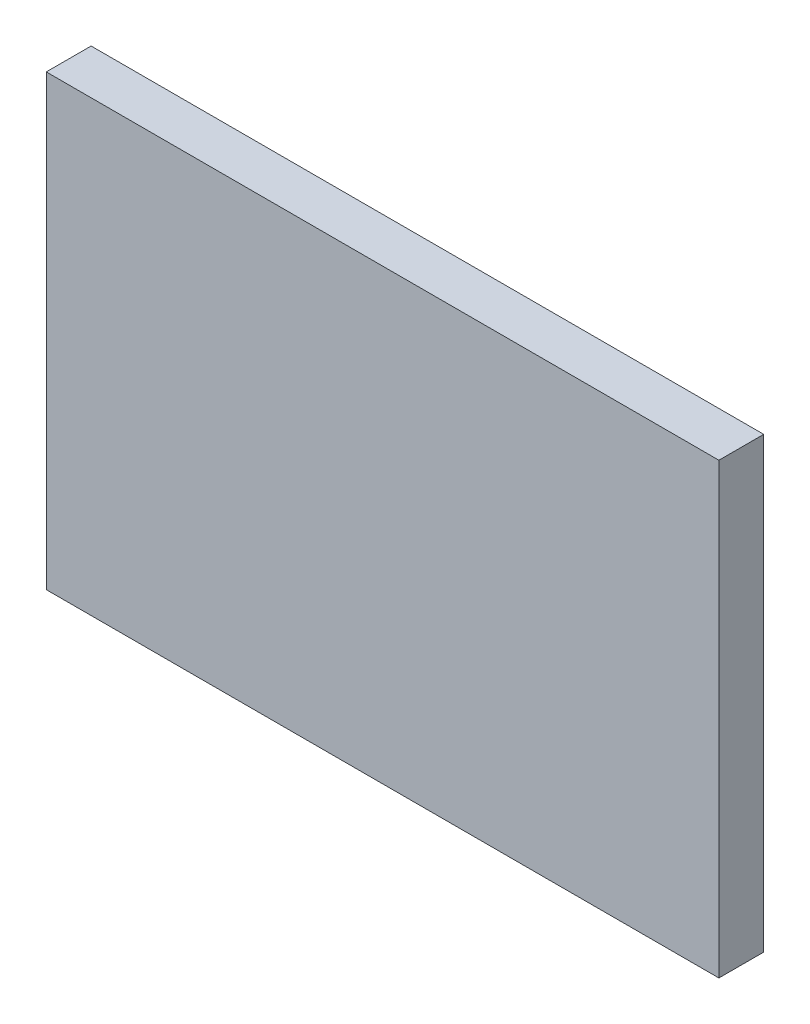
ISO-10303-21;
HEADER;
FILE_DESCRIPTION(('STEP AP214'),'2;1');
FILE_NAME('part.step','',(''),(''),'','','');
FILE_SCHEMA(('AUTOMOTIVE_DESIGN { 1 0 10303 214 1 1 1 1 }'));
ENDSEC;
DATA;
#1=APPLICATION_CONTEXT('core data for automotive mechanical design processes');
#2=APPLICATION_PROTOCOL_DEFINITION('international standard','automotive_design',2000,#1);
#3=PRODUCT_CONTEXT('',#1,'mechanical');
#4=PRODUCT('Part','Part','',(#3));
#5=PRODUCT_RELATED_PRODUCT_CATEGORY('part','',(#4));
#6=PRODUCT_DEFINITION_FORMATION('','',#4);
#7=PRODUCT_DEFINITION_CONTEXT('part definition',#1,'design');
#8=PRODUCT_DEFINITION('design','',#6,#7);
#9=PRODUCT_DEFINITION_SHAPE('','',#8);
#10=(LENGTH_UNIT() NAMED_UNIT(*) SI_UNIT(.MILLI.,.METRE.));
#11=(NAMED_UNIT(*) PLANE_ANGLE_UNIT() SI_UNIT($,.RADIAN.));
#12=(NAMED_UNIT(*) SI_UNIT($,.STERADIAN.) SOLID_ANGLE_UNIT());
#13=UNCERTAINTY_MEASURE_WITH_UNIT(LENGTH_MEASURE(1.E-05),#10,'distance_accuracy_value','');
#14=(GEOMETRIC_REPRESENTATION_CONTEXT(3) GLOBAL_UNCERTAINTY_ASSIGNED_CONTEXT((#13)) GLOBAL_UNIT_ASSIGNED_CONTEXT((#10,
#11,#12)) REPRESENTATION_CONTEXT('',''));
#15=CARTESIAN_POINT('',(0.,0.,0.));
#16=DIRECTION('',(0.,0.,1.));
#17=DIRECTION('',(1.,0.,0.));
#18=AXIS2_PLACEMENT_3D('',#15,#16,#17);
#19=CARTESIAN_POINT('',(0.,0.,2.));
#20=DIRECTION('',(0.,0.,1.));
#21=DIRECTION('',(0.,-1.,0.));
#22=AXIS2_PLACEMENT_3D('',#19,#20,#21);
#23=PLANE('',#22);
#24=DIRECTION('',(1.,0.,0.));
#25=VECTOR('',#24,1.);
#26=CARTESIAN_POINT('',(15.,9.99999999999996,1.99999999999996));
#27=LINE('',#26,#25);
#28=CARTESIAN_POINT('',(-15.,10.0000000000001,1.99999999999996));
#29=VERTEX_POINT('',#28);
#30=CARTESIAN_POINT('',(15.,9.99999999999996,1.99999999999996));
#31=VERTEX_POINT('',#30);
#32=EDGE_CURVE('E127',#29,#31,#27,.T.);
#33=ORIENTED_EDGE('',*,*,#32,.F.);
#34=DIRECTION('',(0.,1.,0.));
#35=VECTOR('',#34,1.);
#36=CARTESIAN_POINT('',(-15.,10.0000000000001,1.99999999999996));
#37=LINE('',#36,#35);
#38=CARTESIAN_POINT('',(-15.,-9.99999999999994,2.00000000000004));
#39=VERTEX_POINT('',#38);
#40=EDGE_CURVE('E125',#39,#29,#37,.T.);
#41=ORIENTED_EDGE('',*,*,#40,.F.);
#42=DIRECTION('',(-1.,0.,0.));
#43=VECTOR('',#42,1.);
#44=CARTESIAN_POINT('',(-15.,-9.99999999999994,2.00000000000004));
#45=LINE('',#44,#43);
#46=CARTESIAN_POINT('',(15.,-10.,2.00000000000004));
#47=VERTEX_POINT('',#46);
#48=EDGE_CURVE('E61',#47,#39,#45,.T.);
#49=ORIENTED_EDGE('',*,*,#48,.F.);
#50=DIRECTION('',(0.,-1.,0.));
#51=VECTOR('',#50,1.);
#52=CARTESIAN_POINT('',(15.,-10.,2.00000000000004));
#53=LINE('',#52,#51);
#54=EDGE_CURVE('E12',#31,#47,#53,.T.);
#55=ORIENTED_EDGE('',*,*,#54,.F.);
#56=EDGE_LOOP('',(#33,#41,#49,#55));
#57=FACE_BOUND('',#56,.T.);
#58=ADVANCED_FACE('F51',(#57),#23,.T.);
#59=CARTESIAN_POINT('',(0.,0.,0.));
#60=DIRECTION('',(0.,0.,1.));
#61=DIRECTION('',(1.,0.,0.));
#62=AXIS2_PLACEMENT_3D('',#59,#60,#61);
#63=PLANE('',#62);
#64=DIRECTION('',(-1.,0.,0.));
#65=VECTOR('',#64,1.);
#66=CARTESIAN_POINT('',(15.,10.,0.));
#67=LINE('',#66,#65);
#68=CARTESIAN_POINT('',(15.,10.,0.));
#69=VERTEX_POINT('',#68);
#70=CARTESIAN_POINT('',(-15.,10.,0.));
#71=VERTEX_POINT('',#70);
#72=EDGE_CURVE('E100',#69,#71,#67,.T.);
#73=ORIENTED_EDGE('',*,*,#72,.F.);
#74=DIRECTION('',(0.,1.,0.));
#75=VECTOR('',#74,1.);
#76=CARTESIAN_POINT('',(15.,-10.,0.));
#77=LINE('',#76,#75);
#78=CARTESIAN_POINT('',(15.,-10.,0.));
#79=VERTEX_POINT('',#78);
#80=EDGE_CURVE('E179',#79,#69,#77,.T.);
#81=ORIENTED_EDGE('',*,*,#80,.F.);
#82=DIRECTION('',(1.,0.,0.));
#83=VECTOR('',#82,1.);
#84=CARTESIAN_POINT('',(-15.,-10.,0.));
#85=LINE('',#84,#83);
#86=CARTESIAN_POINT('',(-15.,-10.,0.));
#87=VERTEX_POINT('',#86);
#88=EDGE_CURVE('E102',#87,#79,#85,.T.);
#89=ORIENTED_EDGE('',*,*,#88,.F.);
#90=DIRECTION('',(0.,-1.,0.));
#91=VECTOR('',#90,1.);
#92=CARTESIAN_POINT('',(-15.,10.,0.));
#93=LINE('',#92,#91);
#94=EDGE_CURVE('E96',#71,#87,#93,.T.);
#95=ORIENTED_EDGE('',*,*,#94,.F.);
#96=EDGE_LOOP('',(#73,#81,#89,#95));
#97=FACE_BOUND('',#96,.T.);
#98=ADVANCED_FACE('F99',(#97),#63,.F.);
#99=CARTESIAN_POINT('',(0.,-9.99999999999995,-2.42861286636748E-13));
#100=DIRECTION('',(0.,-1.,0.));
#101=DIRECTION('',(0.,0.,-1.));
#102=AXIS2_PLACEMENT_3D('',#99,#100,#101);
#103=PLANE('',#102);
#104=DIRECTION('',(0.,0.,1.));
#105=VECTOR('',#104,1.);
#106=CARTESIAN_POINT('',(15.,-10.,0.));
#107=LINE('',#106,#105);
#108=EDGE_CURVE('E76',#79,#47,#107,.T.);
#109=ORIENTED_EDGE('',*,*,#108,.T.);
#110=ORIENTED_EDGE('',*,*,#48,.T.);
#111=DIRECTION('',(0.,0.,1.));
#112=VECTOR('',#111,1.);
#113=CARTESIAN_POINT('',(-15.,-10.,0.));
#114=LINE('',#113,#112);
#115=EDGE_CURVE('E130',#87,#39,#114,.T.);
#116=ORIENTED_EDGE('',*,*,#115,.F.);
#117=ORIENTED_EDGE('',*,*,#88,.T.);
#118=EDGE_LOOP('',(#109,#110,#116,#117));
#119=FACE_BOUND('',#118,.T.);
#120=ADVANCED_FACE('F152',(#119),#103,.T.);
#121=CARTESIAN_POINT('',(-15.,0.,-3.51281503885296E-13));
#122=DIRECTION('',(-1.,0.,0.));
#123=DIRECTION('',(0.,0.,1.));
#124=AXIS2_PLACEMENT_3D('',#121,#122,#123);
#125=PLANE('',#124);
#126=ORIENTED_EDGE('',*,*,#115,.T.);
#127=ORIENTED_EDGE('',*,*,#40,.T.);
#128=DIRECTION('',(0.,0.,1.));
#129=VECTOR('',#128,1.);
#130=CARTESIAN_POINT('',(-15.,10.,0.));
#131=LINE('',#130,#129);
#132=EDGE_CURVE('E116',#71,#29,#131,.T.);
#133=ORIENTED_EDGE('',*,*,#132,.F.);
#134=ORIENTED_EDGE('',*,*,#94,.T.);
#135=EDGE_LOOP('',(#126,#127,#133,#134));
#136=FACE_BOUND('',#135,.T.);
#137=ADVANCED_FACE('F123',(#136),#125,.T.);
#138=CARTESIAN_POINT('',(15.,0.,-3.38271077815482E-13));
#139=DIRECTION('',(1.,0.,0.));
#140=DIRECTION('',(0.,0.,-1.));
#141=AXIS2_PLACEMENT_3D('',#138,#139,#140);
#142=PLANE('',#141);
#143=DIRECTION('',(0.,0.,1.));
#144=VECTOR('',#143,1.);
#145=CARTESIAN_POINT('',(15.,10.,0.));
#146=LINE('',#145,#144);
#147=EDGE_CURVE('E118',#69,#31,#146,.T.);
#148=ORIENTED_EDGE('',*,*,#147,.T.);
#149=ORIENTED_EDGE('',*,*,#54,.T.);
#150=ORIENTED_EDGE('',*,*,#108,.F.);
#151=ORIENTED_EDGE('',*,*,#80,.T.);
#152=EDGE_LOOP('',(#148,#149,#150,#151));
#153=FACE_BOUND('',#152,.T.);
#154=ADVANCED_FACE('F151',(#153),#142,.T.);
#155=CARTESIAN_POINT('',(0.,9.99999999999994,-3.20923843055714E-13));
#156=DIRECTION('',(0.,1.,0.));
#157=DIRECTION('',(0.,0.,1.));
#158=AXIS2_PLACEMENT_3D('',#155,#156,#157);
#159=PLANE('',#158);
#160=ORIENTED_EDGE('',*,*,#132,.T.);
#161=ORIENTED_EDGE('',*,*,#32,.T.);
#162=ORIENTED_EDGE('',*,*,#147,.F.);
#163=ORIENTED_EDGE('',*,*,#72,.T.);
#164=EDGE_LOOP('',(#160,#161,#162,#163));
#165=FACE_BOUND('',#164,.T.);
#166=ADVANCED_FACE('F115',(#165),#159,.T.);
#167=CLOSED_SHELL('',(#58,#98,#120,#137,#154,#166));
#168=MANIFOLD_SOLID_BREP('B2',#167);
#169=ADVANCED_BREP_SHAPE_REPRESENTATION('',(#18,#168),#14);
#170=SHAPE_DEFINITION_REPRESENTATION(#9,#169);
ENDSEC;
END-ISO-10303-21;
